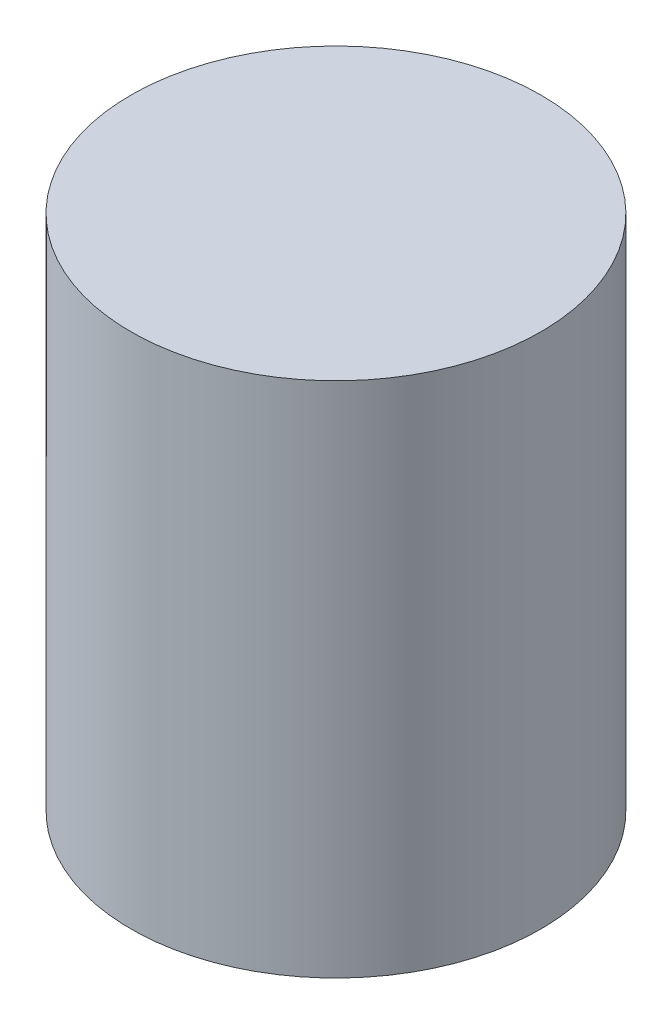
ISO-10303-21;
HEADER;
FILE_DESCRIPTION(('STEP AP214'),'2;1');
FILE_NAME('part.step','',(''),(''),'','','');
FILE_SCHEMA(('AUTOMOTIVE_DESIGN { 1 0 10303 214 1 1 1 1 }'));
ENDSEC;
DATA;
#1=APPLICATION_CONTEXT('core data for automotive mechanical design processes');
#2=APPLICATION_PROTOCOL_DEFINITION('international standard','automotive_design',2000,#1);
#3=PRODUCT_CONTEXT('',#1,'mechanical');
#4=PRODUCT('Part','Part','',(#3));
#5=PRODUCT_RELATED_PRODUCT_CATEGORY('part','',(#4));
#6=PRODUCT_DEFINITION_FORMATION('','',#4);
#7=PRODUCT_DEFINITION_CONTEXT('part definition',#1,'design');
#8=PRODUCT_DEFINITION('design','',#6,#7);
#9=PRODUCT_DEFINITION_SHAPE('','',#8);
#10=(LENGTH_UNIT() NAMED_UNIT(*) SI_UNIT(.MILLI.,.METRE.));
#11=(NAMED_UNIT(*) PLANE_ANGLE_UNIT() SI_UNIT($,.RADIAN.));
#12=(NAMED_UNIT(*) SI_UNIT($,.STERADIAN.) SOLID_ANGLE_UNIT());
#13=UNCERTAINTY_MEASURE_WITH_UNIT(LENGTH_MEASURE(1.E-05),#10,'distance_accuracy_value','');
#14=(GEOMETRIC_REPRESENTATION_CONTEXT(3) GLOBAL_UNCERTAINTY_ASSIGNED_CONTEXT((#13)) GLOBAL_UNIT_ASSIGNED_CONTEXT((#10,
#11,#12)) REPRESENTATION_CONTEXT('',''));
#15=CARTESIAN_POINT('',(0.,0.,0.));
#16=DIRECTION('',(0.,0.,1.));
#17=DIRECTION('',(1.,0.,0.));
#18=AXIS2_PLACEMENT_3D('',#15,#16,#17);
#19=CARTESIAN_POINT('',(0.,0.,0.));
#20=DIRECTION('',(0.,-1.,0.));
#21=DIRECTION('',(0.,0.,-1.));
#22=AXIS2_PLACEMENT_3D('',#19,#20,#21);
#23=CYLINDRICAL_SURFACE('',#22,20.);
#24=CARTESIAN_POINT('',(0.,-10.4579043470085,0.));
#25=DIRECTION('',(0.,-1.,0.));
#26=DIRECTION('',(0.,0.,-1.));
#27=AXIS2_PLACEMENT_3D('',#24,#25,#26);
#28=CIRCLE('',#27,20.);
#29=CARTESIAN_POINT('',(0.,-10.4579043470085,-20.));
#30=VERTEX_POINT('',#29);
#31=EDGE_CURVE('E10',#30,#30,#28,.T.);
#32=ORIENTED_EDGE('',*,*,#31,.F.);
#33=EDGE_LOOP('',(#32));
#34=FACE_BOUND('',#33,.T.);
#35=CARTESIAN_POINT('',(0.,40.,0.));
#36=DIRECTION('',(0.,-1.,0.));
#37=DIRECTION('',(0.,0.,-1.));
#38=AXIS2_PLACEMENT_3D('',#35,#36,#37);
#39=CIRCLE('',#38,20.);
#40=CARTESIAN_POINT('',(0.,40.,-20.));
#41=VERTEX_POINT('',#40);
#42=EDGE_CURVE('E57',#41,#41,#39,.T.);
#43=ORIENTED_EDGE('',*,*,#42,.T.);
#44=EDGE_LOOP('',(#43));
#45=FACE_BOUND('',#44,.T.);
#46=ADVANCED_FACE('F35',(#34,#45),#23,.T.);
#47=CARTESIAN_POINT('',(0.,-10.4579043470085,0.));
#48=DIRECTION('',(0.,1.,0.));
#49=DIRECTION('',(0.,0.,1.));
#50=AXIS2_PLACEMENT_3D('',#47,#48,#49);
#51=PLANE('',#50);
#52=CARTESIAN_POINT('',(0.,-10.4579043470085,0.));
#53=DIRECTION('',(0.,-1.,0.));
#54=DIRECTION('',(0.,0.,-1.));
#55=AXIS2_PLACEMENT_3D('',#52,#53,#54);
#56=CIRCLE('',#55,18.);
#57=CARTESIAN_POINT('',(0.,-10.4579043470085,-18.));
#58=VERTEX_POINT('',#57);
#59=EDGE_CURVE('E41',#58,#58,#56,.T.);
#60=ORIENTED_EDGE('',*,*,#59,.F.);
#61=EDGE_LOOP('',(#60));
#62=FACE_BOUND('',#61,.T.);
#63=ORIENTED_EDGE('',*,*,#31,.T.);
#64=EDGE_LOOP('',(#63));
#65=FACE_BOUND('',#64,.T.);
#66=ADVANCED_FACE('F73',(#62,#65),#51,.F.);
#67=CARTESIAN_POINT('',(0.,0.,0.));
#68=DIRECTION('',(0.,-1.,0.));
#69=DIRECTION('',(0.,0.,-1.));
#70=AXIS2_PLACEMENT_3D('',#67,#68,#69);
#71=CYLINDRICAL_SURFACE('',#70,18.);
#72=CARTESIAN_POINT('',(0.,0.,0.));
#73=DIRECTION('',(0.,-1.,0.));
#74=DIRECTION('',(0.,0.,-1.));
#75=AXIS2_PLACEMENT_3D('',#72,#73,#74);
#76=CIRCLE('',#75,18.);
#77=CARTESIAN_POINT('',(0.,0.,-18.));
#78=VERTEX_POINT('',#77);
#79=EDGE_CURVE('E45',#78,#78,#76,.T.);
#80=ORIENTED_EDGE('',*,*,#79,.F.);
#81=EDGE_LOOP('',(#80));
#82=FACE_BOUND('',#81,.T.);
#83=ORIENTED_EDGE('',*,*,#59,.T.);
#84=EDGE_LOOP('',(#83));
#85=FACE_BOUND('',#84,.T.);
#86=ADVANCED_FACE('F78',(#82,#85),#71,.F.);
#87=CARTESIAN_POINT('',(0.,0.,0.));
#88=DIRECTION('',(0.,1.,0.));
#89=DIRECTION('',(0.,0.,1.));
#90=AXIS2_PLACEMENT_3D('',#87,#88,#89);
#91=PLANE('',#90);
#92=CARTESIAN_POINT('',(0.,0.,0.));
#93=DIRECTION('',(0.,-1.,0.));
#94=DIRECTION('',(0.,0.,-1.));
#95=AXIS2_PLACEMENT_3D('',#92,#93,#94);
#96=CIRCLE('',#95,14.);
#97=CARTESIAN_POINT('',(0.,0.,-14.));
#98=VERTEX_POINT('',#97);
#99=EDGE_CURVE('E49',#98,#98,#96,.T.);
#100=ORIENTED_EDGE('',*,*,#99,.F.);
#101=EDGE_LOOP('',(#100));
#102=FACE_BOUND('',#101,.T.);
#103=ORIENTED_EDGE('',*,*,#79,.T.);
#104=EDGE_LOOP('',(#103));
#105=FACE_BOUND('',#104,.T.);
#106=ADVANCED_FACE('F83',(#102,#105),#91,.F.);
#107=CARTESIAN_POINT('',(0.,0.,0.));
#108=DIRECTION('',(0.,-1.,0.));
#109=DIRECTION('',(0.,0.,-1.));
#110=AXIS2_PLACEMENT_3D('',#107,#108,#109);
#111=CYLINDRICAL_SURFACE('',#110,14.);
#112=CARTESIAN_POINT('',(0.,35.,0.));
#113=DIRECTION('',(0.,-1.,0.));
#114=DIRECTION('',(0.,0.,-1.));
#115=AXIS2_PLACEMENT_3D('',#112,#113,#114);
#116=CIRCLE('',#115,14.);
#117=CARTESIAN_POINT('',(0.,35.,-14.));
#118=VERTEX_POINT('',#117);
#119=EDGE_CURVE('E54',#118,#118,#116,.T.);
#120=ORIENTED_EDGE('',*,*,#119,.F.);
#121=EDGE_LOOP('',(#120));
#122=FACE_BOUND('',#121,.T.);
#123=ORIENTED_EDGE('',*,*,#99,.T.);
#124=EDGE_LOOP('',(#123));
#125=FACE_BOUND('',#124,.T.);
#126=ADVANCED_FACE('F69',(#122,#125),#111,.F.);
#127=CARTESIAN_POINT('',(0.,35.,0.));
#128=DIRECTION('',(0.,1.,0.));
#129=DIRECTION('',(0.,0.,1.));
#130=AXIS2_PLACEMENT_3D('',#127,#128,#129);
#131=PLANE('',#130);
#132=ORIENTED_EDGE('',*,*,#119,.T.);
#133=EDGE_LOOP('',(#132));
#134=FACE_BOUND('',#133,.T.);
#135=ADVANCED_FACE('F64',(#134),#131,.F.);
#136=CARTESIAN_POINT('',(0.,40.,0.));
#137=DIRECTION('',(0.,-1.,0.));
#138=DIRECTION('',(0.,0.,-1.));
#139=AXIS2_PLACEMENT_3D('',#136,#137,#138);
#140=PLANE('',#139);
#141=ORIENTED_EDGE('',*,*,#42,.F.);
#142=EDGE_LOOP('',(#141));
#143=FACE_BOUND('',#142,.T.);
#144=ADVANCED_FACE('F62',(#143),#140,.F.);
#145=CLOSED_SHELL('',(#46,#66,#86,#106,#126,#135,#144));
#146=MANIFOLD_SOLID_BREP('B2',#145);
#147=ADVANCED_BREP_SHAPE_REPRESENTATION('',(#18,#146),#14);
#148=SHAPE_DEFINITION_REPRESENTATION(#9,#147);
ENDSEC;
END-ISO-10303-21;
